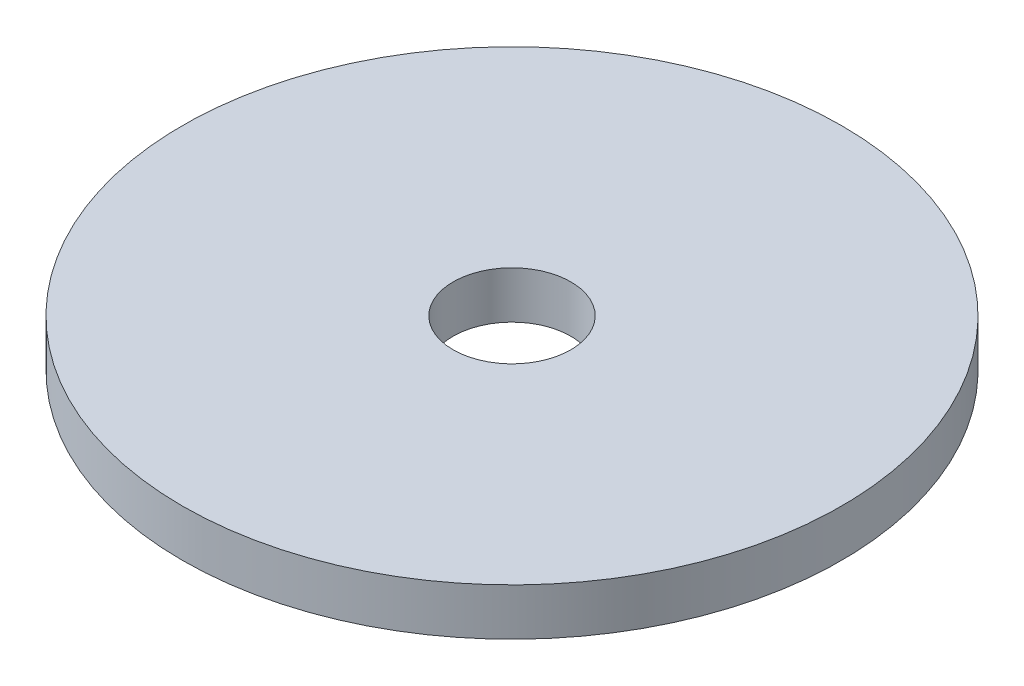
ISO-10303-21;
HEADER;
FILE_DESCRIPTION(('STEP AP214'),'2;1');
FILE_NAME('part.step','',(''),(''),'','','');
FILE_SCHEMA(('AUTOMOTIVE_DESIGN { 1 0 10303 214 1 1 1 1 }'));
ENDSEC;
DATA;
#1=APPLICATION_CONTEXT('core data for automotive mechanical design processes');
#2=APPLICATION_PROTOCOL_DEFINITION('international standard','automotive_design',2000,#1);
#3=PRODUCT_CONTEXT('',#1,'mechanical');
#4=PRODUCT('Part','Part','',(#3));
#5=PRODUCT_RELATED_PRODUCT_CATEGORY('part','',(#4));
#6=PRODUCT_DEFINITION_FORMATION('','',#4);
#7=PRODUCT_DEFINITION_CONTEXT('part definition',#1,'design');
#8=PRODUCT_DEFINITION('design','',#6,#7);
#9=PRODUCT_DEFINITION_SHAPE('','',#8);
#10=(LENGTH_UNIT() NAMED_UNIT(*) SI_UNIT(.MILLI.,.METRE.));
#11=(NAMED_UNIT(*) PLANE_ANGLE_UNIT() SI_UNIT($,.RADIAN.));
#12=(NAMED_UNIT(*) SI_UNIT($,.STERADIAN.) SOLID_ANGLE_UNIT());
#13=UNCERTAINTY_MEASURE_WITH_UNIT(LENGTH_MEASURE(1.E-05),#10,'distance_accuracy_value','');
#14=(GEOMETRIC_REPRESENTATION_CONTEXT(3) GLOBAL_UNCERTAINTY_ASSIGNED_CONTEXT((#13)) GLOBAL_UNIT_ASSIGNED_CONTEXT((#10,
#11,#12)) REPRESENTATION_CONTEXT('',''));
#15=CARTESIAN_POINT('',(0.,0.,0.));
#16=DIRECTION('',(0.,0.,1.));
#17=DIRECTION('',(1.,0.,0.));
#18=AXIS2_PLACEMENT_3D('',#15,#16,#17);
#19=CARTESIAN_POINT('',(0.,2.,0.));
#20=DIRECTION('',(0.,-1.,0.));
#21=DIRECTION('',(0.,0.,-1.));
#22=AXIS2_PLACEMENT_3D('',#19,#20,#21);
#23=CYLINDRICAL_SURFACE('',#22,14.);
#24=CARTESIAN_POINT('',(0.,2.,0.));
#25=DIRECTION('',(0.,1.,0.));
#26=DIRECTION('',(0.,0.,1.));
#27=AXIS2_PLACEMENT_3D('',#24,#25,#26);
#28=CIRCLE('',#27,14.);
#29=CARTESIAN_POINT('',(0.,2.,14.));
#30=VERTEX_POINT('',#29);
#31=EDGE_CURVE('E10',#30,#30,#28,.T.);
#32=ORIENTED_EDGE('',*,*,#31,.F.);
#33=EDGE_LOOP('',(#32));
#34=FACE_BOUND('',#33,.T.);
#35=CARTESIAN_POINT('',(0.,0.,0.));
#36=DIRECTION('',(0.,1.,0.));
#37=DIRECTION('',(0.,0.,1.));
#38=AXIS2_PLACEMENT_3D('',#35,#36,#37);
#39=CIRCLE('',#38,14.);
#40=CARTESIAN_POINT('',(0.,0.,14.));
#41=VERTEX_POINT('',#40);
#42=EDGE_CURVE('E34',#41,#41,#39,.T.);
#43=ORIENTED_EDGE('',*,*,#42,.T.);
#44=EDGE_LOOP('',(#43));
#45=FACE_BOUND('',#44,.T.);
#46=ADVANCED_FACE('F31',(#34,#45),#23,.T.);
#47=CARTESIAN_POINT('',(0.,2.,0.));
#48=DIRECTION('',(0.,1.,0.));
#49=DIRECTION('',(0.,0.,1.));
#50=AXIS2_PLACEMENT_3D('',#47,#48,#49);
#51=PLANE('',#50);
#52=CARTESIAN_POINT('',(0.,2.,0.));
#53=DIRECTION('',(0.,1.,0.));
#54=DIRECTION('',(0.,0.,1.));
#55=AXIS2_PLACEMENT_3D('',#52,#53,#54);
#56=CIRCLE('',#55,2.5);
#57=CARTESIAN_POINT('',(0.,2.,2.5));
#58=VERTEX_POINT('',#57);
#59=EDGE_CURVE('E41',#58,#58,#56,.F.);
#60=ORIENTED_EDGE('',*,*,#59,.T.);
#61=EDGE_LOOP('',(#60));
#62=FACE_BOUND('',#61,.T.);
#63=ORIENTED_EDGE('',*,*,#31,.T.);
#64=EDGE_LOOP('',(#63));
#65=FACE_BOUND('',#64,.T.);
#66=ADVANCED_FACE('F59',(#62,#65),#51,.T.);
#67=CARTESIAN_POINT('',(0.,0.,0.));
#68=DIRECTION('',(0.,1.,0.));
#69=DIRECTION('',(0.,0.,1.));
#70=AXIS2_PLACEMENT_3D('',#67,#68,#69);
#71=PLANE('',#70);
#72=CARTESIAN_POINT('',(0.,0.,0.));
#73=DIRECTION('',(0.,1.,0.));
#74=DIRECTION('',(0.,0.,1.));
#75=AXIS2_PLACEMENT_3D('',#72,#73,#74);
#76=CIRCLE('',#75,2.5);
#77=CARTESIAN_POINT('',(0.,0.,2.5));
#78=VERTEX_POINT('',#77);
#79=EDGE_CURVE('E45',#78,#78,#76,.T.);
#80=ORIENTED_EDGE('',*,*,#79,.T.);
#81=EDGE_LOOP('',(#80));
#82=FACE_BOUND('',#81,.T.);
#83=ORIENTED_EDGE('',*,*,#42,.F.);
#84=EDGE_LOOP('',(#83));
#85=FACE_BOUND('',#84,.T.);
#86=ADVANCED_FACE('F49',(#82,#85),#71,.F.);
#87=CARTESIAN_POINT('',(0.,6.,0.));
#88=DIRECTION('',(0.,-1.,0.));
#89=DIRECTION('',(0.,0.,-1.));
#90=AXIS2_PLACEMENT_3D('',#87,#88,#89);
#91=CYLINDRICAL_SURFACE('',#90,2.5);
#92=ORIENTED_EDGE('',*,*,#59,.F.);
#93=EDGE_LOOP('',(#92));
#94=FACE_BOUND('',#93,.T.);
#95=ORIENTED_EDGE('',*,*,#79,.F.);
#96=EDGE_LOOP('',(#95));
#97=FACE_BOUND('',#96,.T.);
#98=ADVANCED_FACE('F52',(#94,#97),#91,.F.);
#99=CLOSED_SHELL('',(#46,#66,#86,#98));
#100=MANIFOLD_SOLID_BREP('B2',#99);
#101=ADVANCED_BREP_SHAPE_REPRESENTATION('',(#18,#100),#14);
#102=SHAPE_DEFINITION_REPRESENTATION(#9,#101);
ENDSEC;
END-ISO-10303-21;
